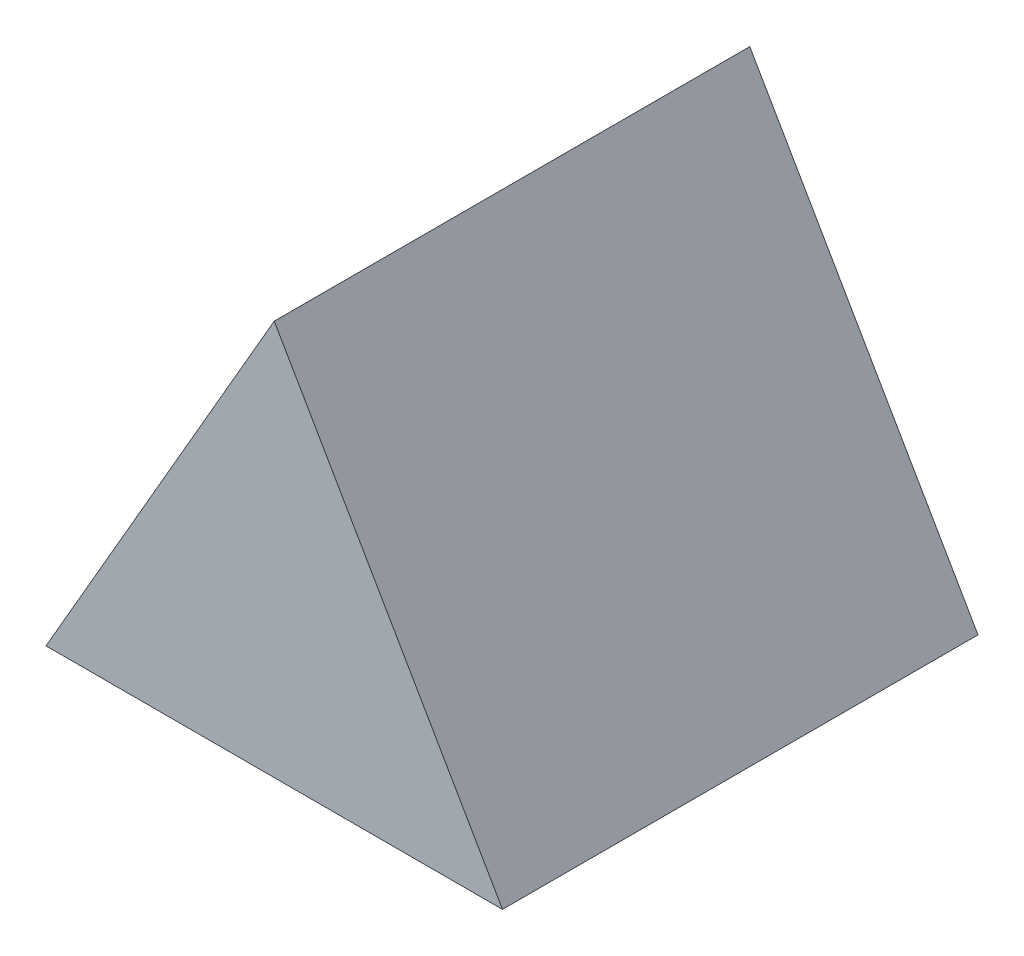
ISO-10303-21;
HEADER;
FILE_DESCRIPTION(('STEP AP214'),'2;1');
FILE_NAME('part.step','',(''),(''),'','','');
FILE_SCHEMA(('AUTOMOTIVE_DESIGN { 1 0 10303 214 1 1 1 1 }'));
ENDSEC;
DATA;
#1=APPLICATION_CONTEXT('core data for automotive mechanical design processes');
#2=APPLICATION_PROTOCOL_DEFINITION('international standard','automotive_design',2000,#1);
#3=PRODUCT_CONTEXT('',#1,'mechanical');
#4=PRODUCT('Part','Part','',(#3));
#5=PRODUCT_RELATED_PRODUCT_CATEGORY('part','',(#4));
#6=PRODUCT_DEFINITION_FORMATION('','',#4);
#7=PRODUCT_DEFINITION_CONTEXT('part definition',#1,'design');
#8=PRODUCT_DEFINITION('design','',#6,#7);
#9=PRODUCT_DEFINITION_SHAPE('','',#8);
#10=(LENGTH_UNIT() NAMED_UNIT(*) SI_UNIT(.MILLI.,.METRE.));
#11=(NAMED_UNIT(*) PLANE_ANGLE_UNIT() SI_UNIT($,.RADIAN.));
#12=(NAMED_UNIT(*) SI_UNIT($,.STERADIAN.) SOLID_ANGLE_UNIT());
#13=UNCERTAINTY_MEASURE_WITH_UNIT(LENGTH_MEASURE(1.E-05),#10,'distance_accuracy_value','');
#14=(GEOMETRIC_REPRESENTATION_CONTEXT(3) GLOBAL_UNCERTAINTY_ASSIGNED_CONTEXT((#13)) GLOBAL_UNIT_ASSIGNED_CONTEXT((#10,
#11,#12)) REPRESENTATION_CONTEXT('',''));
#15=CARTESIAN_POINT('',(0.,0.,0.));
#16=DIRECTION('',(0.,0.,1.));
#17=DIRECTION('',(1.,0.,0.));
#18=AXIS2_PLACEMENT_3D('',#15,#16,#17);
#19=CARTESIAN_POINT('',(24.2044649851173,0.,50.));
#20=DIRECTION('',(-0.866025403784439,-0.5,0.));
#21=DIRECTION('',(0.5,-0.866025403784439,0.));
#22=AXIS2_PLACEMENT_3D('',#19,#20,#21);
#23=PLANE('',#22);
#24=DIRECTION('',(-0.5,0.866025403784439,0.));
#25=VECTOR('',#24,1.);
#26=CARTESIAN_POINT('',(24.2044649851173,0.,0.));
#27=LINE('',#26,#25);
#28=CARTESIAN_POINT('',(24.2044649851173,0.,0.));
#29=VERTEX_POINT('',#28);
#30=CARTESIAN_POINT('',(0.204464985117253,41.5692193816531,0.));
#31=VERTEX_POINT('',#30);
#32=EDGE_CURVE('E80',#29,#31,#27,.T.);
#33=ORIENTED_EDGE('',*,*,#32,.T.);
#34=DIRECTION('',(0.,0.,-1.));
#35=VECTOR('',#34,1.);
#36=CARTESIAN_POINT('',(0.204464985117253,41.5692193816531,50.));
#37=LINE('',#36,#35);
#38=CARTESIAN_POINT('',(0.204464985117253,41.5692193816531,50.));
#39=VERTEX_POINT('',#38);
#40=EDGE_CURVE('E11',#39,#31,#37,.T.);
#41=ORIENTED_EDGE('',*,*,#40,.F.);
#42=DIRECTION('',(-0.5,0.866025403784439,0.));
#43=VECTOR('',#42,1.);
#44=CARTESIAN_POINT('',(24.2044649851173,0.,50.));
#45=LINE('',#44,#43);
#46=CARTESIAN_POINT('',(24.2044649851173,0.,50.));
#47=VERTEX_POINT('',#46);
#48=EDGE_CURVE('E73',#47,#39,#45,.T.);
#49=ORIENTED_EDGE('',*,*,#48,.F.);
#50=DIRECTION('',(0.,0.,-1.));
#51=VECTOR('',#50,1.);
#52=CARTESIAN_POINT('',(24.2044649851173,0.,50.));
#53=LINE('',#52,#51);
#54=EDGE_CURVE('E81',#47,#29,#53,.T.);
#55=ORIENTED_EDGE('',*,*,#54,.T.);
#56=EDGE_LOOP('',(#33,#41,#49,#55));
#57=FACE_BOUND('',#56,.T.);
#58=ADVANCED_FACE('F33',(#57),#23,.F.);
#59=CARTESIAN_POINT('',(0.204464985117253,41.5692193816531,50.));
#60=DIRECTION('',(0.866025403784439,-0.5,0.));
#61=DIRECTION('',(0.5,0.866025403784439,0.));
#62=AXIS2_PLACEMENT_3D('',#59,#60,#61);
#63=PLANE('',#62);
#64=DIRECTION('',(-0.5,-0.866025403784439,0.));
#65=VECTOR('',#64,1.);
#66=CARTESIAN_POINT('',(0.204464985117253,41.5692193816531,0.));
#67=LINE('',#66,#65);
#68=CARTESIAN_POINT('',(-23.7955350148827,0.,0.));
#69=VERTEX_POINT('',#68);
#70=EDGE_CURVE('E61',#31,#69,#67,.T.);
#71=ORIENTED_EDGE('',*,*,#70,.T.);
#72=DIRECTION('',(0.,0.,-1.));
#73=VECTOR('',#72,1.);
#74=CARTESIAN_POINT('',(-23.7955350148827,0.,50.));
#75=LINE('',#74,#73);
#76=CARTESIAN_POINT('',(-23.7955350148827,0.,50.));
#77=VERTEX_POINT('',#76);
#78=EDGE_CURVE('E41',#77,#69,#75,.T.);
#79=ORIENTED_EDGE('',*,*,#78,.F.);
#80=DIRECTION('',(-0.5,-0.866025403784439,0.));
#81=VECTOR('',#80,1.);
#82=CARTESIAN_POINT('',(0.204464985117253,41.5692193816531,50.));
#83=LINE('',#82,#81);
#84=EDGE_CURVE('E69',#39,#77,#83,.T.);
#85=ORIENTED_EDGE('',*,*,#84,.F.);
#86=ORIENTED_EDGE('',*,*,#40,.T.);
#87=EDGE_LOOP('',(#71,#79,#85,#86));
#88=FACE_BOUND('',#87,.T.);
#89=ADVANCED_FACE('F70',(#88),#63,.F.);
#90=CARTESIAN_POINT('',(-23.7955350148827,0.,50.));
#91=DIRECTION('',(0.,1.,0.));
#92=DIRECTION('',(0.,0.,1.));
#93=AXIS2_PLACEMENT_3D('',#90,#91,#92);
#94=PLANE('',#93);
#95=DIRECTION('',(1.,0.,0.));
#96=VECTOR('',#95,1.);
#97=CARTESIAN_POINT('',(-23.7955350148827,0.,0.));
#98=LINE('',#97,#96);
#99=EDGE_CURVE('E66',#69,#29,#98,.T.);
#100=ORIENTED_EDGE('',*,*,#99,.T.);
#101=ORIENTED_EDGE('',*,*,#54,.F.);
#102=DIRECTION('',(1.,0.,0.));
#103=VECTOR('',#102,1.);
#104=CARTESIAN_POINT('',(-23.7955350148827,0.,50.));
#105=LINE('',#104,#103);
#106=EDGE_CURVE('E49',#77,#47,#105,.T.);
#107=ORIENTED_EDGE('',*,*,#106,.F.);
#108=ORIENTED_EDGE('',*,*,#78,.T.);
#109=EDGE_LOOP('',(#100,#101,#107,#108));
#110=FACE_BOUND('',#109,.T.);
#111=ADVANCED_FACE('F92',(#110),#94,.F.);
#112=CARTESIAN_POINT('',(0.,0.,50.));
#113=DIRECTION('',(0.,0.,1.));
#114=DIRECTION('',(1.,0.,0.));
#115=AXIS2_PLACEMENT_3D('',#112,#113,#114);
#116=PLANE('',#115);
#117=ORIENTED_EDGE('',*,*,#48,.T.);
#118=ORIENTED_EDGE('',*,*,#84,.T.);
#119=ORIENTED_EDGE('',*,*,#106,.T.);
#120=EDGE_LOOP('',(#117,#118,#119));
#121=FACE_BOUND('',#120,.T.);
#122=ADVANCED_FACE('F76',(#121),#116,.T.);
#123=CARTESIAN_POINT('',(0.,0.,0.));
#124=DIRECTION('',(0.,0.,1.));
#125=DIRECTION('',(1.,0.,0.));
#126=AXIS2_PLACEMENT_3D('',#123,#124,#125);
#127=PLANE('',#126);
#128=CARTESIAN_POINT('',(0.,14.2387225882003,0.));
#129=DIRECTION('',(0.,0.,-1.));
#130=DIRECTION('',(-1.,0.,0.));
#131=AXIS2_PLACEMENT_3D('',#128,#129,#130);
#132=CIRCLE('',#131,2.48210088949428);
#133=CARTESIAN_POINT('',(-2.48210088949428,14.2387225882003,0.));
#134=VERTEX_POINT('',#133);
#135=EDGE_CURVE('E87',#134,#134,#132,.T.);
#136=ORIENTED_EDGE('',*,*,#135,.F.);
#137=EDGE_LOOP('',(#136));
#138=FACE_BOUND('',#137,.T.);
#139=ORIENTED_EDGE('',*,*,#32,.F.);
#140=ORIENTED_EDGE('',*,*,#99,.F.);
#141=ORIENTED_EDGE('',*,*,#70,.F.);
#142=EDGE_LOOP('',(#139,#140,#141));
#143=FACE_BOUND('',#142,.T.);
#144=ADVANCED_FACE('F93',(#138,#143),#127,.F.);
#145=CARTESIAN_POINT('',(0.,14.2387225882003,10.));
#146=DIRECTION('',(0.,0.,-1.));
#147=DIRECTION('',(-1.,0.,0.));
#148=AXIS2_PLACEMENT_3D('',#145,#146,#147);
#149=CYLINDRICAL_SURFACE('',#148,2.48210088949428);
#150=CARTESIAN_POINT('',(0.,14.2387225882003,10.));
#151=DIRECTION('',(0.,0.,-1.));
#152=DIRECTION('',(-1.,0.,0.));
#153=AXIS2_PLACEMENT_3D('',#150,#151,#152);
#154=CIRCLE('',#153,2.48210088949428);
#155=CARTESIAN_POINT('',(-2.48210088949428,14.2387225882003,10.));
#156=VERTEX_POINT('',#155);
#157=EDGE_CURVE('E83',#156,#156,#154,.T.);
#158=ORIENTED_EDGE('',*,*,#157,.F.);
#159=EDGE_LOOP('',(#158));
#160=FACE_BOUND('',#159,.T.);
#161=ORIENTED_EDGE('',*,*,#135,.T.);
#162=EDGE_LOOP('',(#161));
#163=FACE_BOUND('',#162,.T.);
#164=ADVANCED_FACE('F95',(#160,#163),#149,.F.);
#165=CARTESIAN_POINT('',(0.,14.2387225882003,10.));
#166=DIRECTION('',(0.,0.,-1.));
#167=DIRECTION('',(-1.,0.,0.));
#168=AXIS2_PLACEMENT_3D('',#165,#166,#167);
#169=PLANE('',#168);
#170=ORIENTED_EDGE('',*,*,#157,.T.);
#171=EDGE_LOOP('',(#170));
#172=FACE_BOUND('',#171,.T.);
#173=ADVANCED_FACE('F102',(#172),#169,.T.);
#174=CLOSED_SHELL('',(#58,#89,#111,#122,#144,#164,#173));
#175=MANIFOLD_SOLID_BREP('B2',#174);
#176=ADVANCED_BREP_SHAPE_REPRESENTATION('',(#18,#175),#14);
#177=SHAPE_DEFINITION_REPRESENTATION(#9,#176);
ENDSEC;
END-ISO-10303-21;
